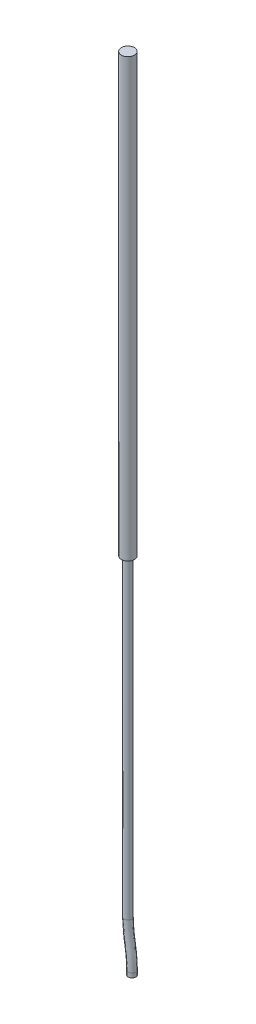
ISO-10303-21;
HEADER;
FILE_DESCRIPTION(('STEP AP214'),'2;1');
FILE_NAME('part.step','',(''),(''),'','','');
FILE_SCHEMA(('AUTOMOTIVE_DESIGN { 1 0 10303 214 1 1 1 1 }'));
ENDSEC;
DATA;
#1=APPLICATION_CONTEXT('core data for automotive mechanical design processes');
#2=APPLICATION_PROTOCOL_DEFINITION('international standard','automotive_design',2000,#1);
#3=PRODUCT_CONTEXT('',#1,'mechanical');
#4=PRODUCT('Part','Part','',(#3));
#5=PRODUCT_RELATED_PRODUCT_CATEGORY('part','',(#4));
#6=PRODUCT_DEFINITION_FORMATION('','',#4);
#7=PRODUCT_DEFINITION_CONTEXT('part definition',#1,'design');
#8=PRODUCT_DEFINITION('design','',#6,#7);
#9=PRODUCT_DEFINITION_SHAPE('','',#8);
#10=(LENGTH_UNIT() NAMED_UNIT(*) SI_UNIT(.MILLI.,.METRE.));
#11=(NAMED_UNIT(*) PLANE_ANGLE_UNIT() SI_UNIT($,.RADIAN.));
#12=(NAMED_UNIT(*) SI_UNIT($,.STERADIAN.) SOLID_ANGLE_UNIT());
#13=UNCERTAINTY_MEASURE_WITH_UNIT(LENGTH_MEASURE(1.E-05),#10,'distance_accuracy_value','');
#14=(GEOMETRIC_REPRESENTATION_CONTEXT(3) GLOBAL_UNCERTAINTY_ASSIGNED_CONTEXT((#13)) GLOBAL_UNIT_ASSIGNED_CONTEXT((#10,
#11,#12)) REPRESENTATION_CONTEXT('',''));
#15=CARTESIAN_POINT('',(0.,0.,0.));
#16=DIRECTION('',(0.,0.,1.));
#17=DIRECTION('',(1.,0.,0.));
#18=AXIS2_PLACEMENT_3D('',#15,#16,#17);
#19=CARTESIAN_POINT('',(0.,143.245,0.));
#20=DIRECTION('',(0.,-1.,0.));
#21=DIRECTION('',(0.,0.,-1.));
#22=AXIS2_PLACEMENT_3D('',#19,#20,#21);
#23=CYLINDRICAL_SURFACE('',#22,1.725);
#24=CARTESIAN_POINT('',(0.,143.245,0.));
#25=DIRECTION('',(0.,1.,0.));
#26=DIRECTION('',(0.,0.,1.));
#27=AXIS2_PLACEMENT_3D('',#24,#25,#26);
#28=CIRCLE('',#27,1.725);
#29=CARTESIAN_POINT('',(0.,143.245,1.725));
#30=VERTEX_POINT('',#29);
#31=EDGE_CURVE('E11',#30,#30,#28,.T.);
#32=ORIENTED_EDGE('',*,*,#31,.F.);
#33=EDGE_LOOP('',(#32));
#34=FACE_BOUND('',#33,.T.);
#35=CARTESIAN_POINT('',(0.,0.,0.));
#36=DIRECTION('',(0.,-1.,0.));
#37=DIRECTION('',(0.,0.,-1.));
#38=AXIS2_PLACEMENT_3D('',#35,#36,#37);
#39=CIRCLE('',#38,1.725);
#40=CARTESIAN_POINT('',(0.,0.,-1.725));
#41=VERTEX_POINT('',#40);
#42=EDGE_CURVE('E64',#41,#41,#39,.T.);
#43=ORIENTED_EDGE('',*,*,#42,.F.);
#44=EDGE_LOOP('',(#43));
#45=FACE_BOUND('',#44,.T.);
#46=ADVANCED_FACE('F46',(#34,#45),#23,.T.);
#47=CARTESIAN_POINT('',(0.,343.245,0.));
#48=DIRECTION('',(0.,-1.,0.));
#49=DIRECTION('',(0.,0.,-1.));
#50=AXIS2_PLACEMENT_3D('',#47,#48,#49);
#51=CYLINDRICAL_SURFACE('',#50,3.);
#52=CARTESIAN_POINT('',(0.,343.245,0.));
#53=DIRECTION('',(0.,1.,0.));
#54=DIRECTION('',(0.,0.,1.));
#55=AXIS2_PLACEMENT_3D('',#52,#53,#54);
#56=CIRCLE('',#55,3.);
#57=CARTESIAN_POINT('',(0.,343.245,3.));
#58=VERTEX_POINT('',#57);
#59=EDGE_CURVE('E55',#58,#58,#56,.T.);
#60=ORIENTED_EDGE('',*,*,#59,.F.);
#61=EDGE_LOOP('',(#60));
#62=FACE_BOUND('',#61,.T.);
#63=CARTESIAN_POINT('',(0.,143.245,0.));
#64=DIRECTION('',(0.,1.,0.));
#65=DIRECTION('',(0.,0.,1.));
#66=AXIS2_PLACEMENT_3D('',#63,#64,#65);
#67=CIRCLE('',#66,3.);
#68=CARTESIAN_POINT('',(0.,143.245,3.));
#69=VERTEX_POINT('',#68);
#70=EDGE_CURVE('E60',#69,#69,#67,.T.);
#71=ORIENTED_EDGE('',*,*,#70,.T.);
#72=EDGE_LOOP('',(#71));
#73=FACE_BOUND('',#72,.T.);
#74=ADVANCED_FACE('F78',(#62,#73),#51,.T.);
#75=CARTESIAN_POINT('',(0.,343.245,0.));
#76=DIRECTION('',(0.,1.,0.));
#77=DIRECTION('',(0.,0.,1.));
#78=AXIS2_PLACEMENT_3D('',#75,#76,#77);
#79=PLANE('',#78);
#80=ORIENTED_EDGE('',*,*,#59,.T.);
#81=EDGE_LOOP('',(#80));
#82=FACE_BOUND('',#81,.T.);
#83=ADVANCED_FACE('F82',(#82),#79,.T.);
#84=CARTESIAN_POINT('',(0.,143.245,0.));
#85=DIRECTION('',(0.,1.,0.));
#86=DIRECTION('',(0.,0.,1.));
#87=AXIS2_PLACEMENT_3D('',#84,#85,#86);
#88=PLANE('',#87);
#89=ORIENTED_EDGE('',*,*,#31,.T.);
#90=EDGE_LOOP('',(#89));
#91=FACE_BOUND('',#90,.T.);
#92=ORIENTED_EDGE('',*,*,#70,.F.);
#93=EDGE_LOOP('',(#92));
#94=FACE_BOUND('',#93,.T.);
#95=ADVANCED_FACE('F80',(#91,#94),#88,.F.);
#96=CARTESIAN_POINT('',(0.,0.,-1.725));
#97=CARTESIAN_POINT('',(0.131632502328734,-2.33887151220292,-1.725));
#98=CARTESIAN_POINT('',(0.263265009517513,-4.67774302389159,-1.725));
#99=CARTESIAN_POINT('',(0.83988268226508,-9.33788737578649,-1.725));
#100=CARTESIAN_POINT('',(1.28697097043585,-11.6589358080879,-1.725));
#101=CARTESIAN_POINT('',(1.74592927651871,-15.9903547135276,-1.725));
#102=CARTESIAN_POINT('',(1.81296464108095,-17.995177356473,-1.725));
#103=CARTESIAN_POINT('',(1.88,-20.,-1.725));
#104=CARTESIAN_POINT('',(3.45,0.,-1.725));
#105=CARTESIAN_POINT('',(3.58163250232873,-2.33887151220305,-1.725));
#106=CARTESIAN_POINT('',(3.71583528934996,-4.60068954340331,-1.725));
#107=CARTESIAN_POINT('',(4.2718140287462,-8.95273048209486,-1.725));
#108=CARTESIAN_POINT('',(4.72313304040415,-11.2935950559469,-1.725));
#109=CARTESIAN_POINT('',(5.19992437907432,-15.9861131761811,-1.725));
#110=CARTESIAN_POINT('',(5.26206823600098,-18.0738182587352,-1.725));
#111=CARTESIAN_POINT('',(5.32910359492035,-20.0786409022552,-1.725));
#112=CARTESIAN_POINT('',(3.45,0.,1.725));
#113=CARTESIAN_POINT('',(3.58163250232873,-2.33887151220305,1.725));
#114=CARTESIAN_POINT('',(3.71583528934996,-4.60068954340331,1.725));
#115=CARTESIAN_POINT('',(4.2718140287462,-8.95273048209486,1.725));
#116=CARTESIAN_POINT('',(4.72313304040415,-11.2935950559469,1.725));
#117=CARTESIAN_POINT('',(5.19992437907432,-15.9861131761811,1.725));
#118=CARTESIAN_POINT('',(5.26206823600098,-18.0738182587352,1.725));
#119=CARTESIAN_POINT('',(5.32910359492035,-20.0786409022552,1.725));
#120=CARTESIAN_POINT('',(0.,0.,1.725));
#121=CARTESIAN_POINT('',(0.131632502328734,-2.33887151220292,1.725));
#122=CARTESIAN_POINT('',(0.263265009517513,-4.67774302389159,1.725));
#123=CARTESIAN_POINT('',(0.839882682265081,-9.33788737578649,1.725));
#124=CARTESIAN_POINT('',(1.28697097043585,-11.6589358080879,1.725));
#125=CARTESIAN_POINT('',(1.74592927651871,-15.9903547135276,1.725));
#126=CARTESIAN_POINT('',(1.81296464108095,-17.995177356473,1.725));
#127=CARTESIAN_POINT('',(1.88,-20.,1.725));
#128=CARTESIAN_POINT('',(-3.45,0.,1.725));
#129=CARTESIAN_POINT('',(-3.31836749767127,-2.33887151220278,1.725));
#130=CARTESIAN_POINT('',(-3.18930527031493,-4.75479650437986,1.725));
#131=CARTESIAN_POINT('',(-2.59204866421604,-9.72304426947813,1.725));
#132=CARTESIAN_POINT('',(-2.14919109953245,-12.0242765602289,1.725));
#133=CARTESIAN_POINT('',(-1.70806582603689,-15.994596250874,1.725));
#134=CARTESIAN_POINT('',(-1.63613895383907,-17.9165364542109,1.725));
#135=CARTESIAN_POINT('',(-1.56910359492035,-19.9213590977448,1.725));
#136=CARTESIAN_POINT('',(-3.45,0.,-1.725));
#137=CARTESIAN_POINT('',(-3.31836749767127,-2.33887151220278,-1.725));
#138=CARTESIAN_POINT('',(-3.18930527031493,-4.75479650437986,-1.725));
#139=CARTESIAN_POINT('',(-2.59204866421604,-9.72304426947813,-1.725));
#140=CARTESIAN_POINT('',(-2.14919109953245,-12.0242765602289,-1.725));
#141=CARTESIAN_POINT('',(-1.70806582603689,-15.994596250874,-1.725));
#142=CARTESIAN_POINT('',(-1.63613895383907,-17.9165364542109,-1.725));
#143=CARTESIAN_POINT('',(-1.56910359492035,-19.9213590977448,-1.725));
#144=CARTESIAN_POINT('',(0.,0.,-1.725));
#145=CARTESIAN_POINT('',(0.131632502328734,-2.33887151220292,-1.725));
#146=CARTESIAN_POINT('',(0.263265009517513,-4.67774302389159,-1.725));
#147=CARTESIAN_POINT('',(0.83988268226508,-9.33788737578649,-1.725));
#148=CARTESIAN_POINT('',(1.28697097043585,-11.6589358080879,-1.725));
#149=CARTESIAN_POINT('',(1.74592927651871,-15.9903547135276,-1.725));
#150=CARTESIAN_POINT('',(1.81296464108095,-17.995177356473,-1.725));
#151=CARTESIAN_POINT('',(1.88,-20.,-1.725));
#152=(BOUNDED_SURFACE() B_SPLINE_SURFACE(3,3,((#96,#97,#98,#99,#100,#101,#102,#103),(#104,#105,
#106,#107,#108,#109,#110,#111),(#112,#113,#114,#115,#116,#117,#118,#119),(#120,#121,#122,#123,
#124,#125,#126,#127),(#128,#129,#130,#131,#132,#133,#134,#135),(#136,#137,#138,#139,#140,#141,
#142,#143),(#144,#145,#146,#147,#148,#149,#150,#151)),.UNSPECIFIED.,.T.,.F.,
.F.) B_SPLINE_SURFACE_WITH_KNOTS((4,3,4),(4,2,2,4),(0.,0.5,1.),(0.,0.349327238871358,
0.7010056922802,1.),
.UNSPECIFIED.) GEOMETRIC_REPRESENTATION_ITEM() RATIONAL_B_SPLINE_SURFACE(((1.,1.,1.,1.,1.,1.,1.,
1.),(0.333333333333333,0.333333333333333,0.333333333333333,0.333333333333333,0.333333333333333,
0.333333333333333,0.333333333333333,0.333333333333333),(0.333333333333333,0.333333333333333,
0.333333333333333,0.333333333333333,0.333333333333333,0.333333333333333,0.333333333333333,
0.333333333333333),(1.,1.,1.,1.,1.,1.,1.,1.),(0.333333333333333,0.333333333333333,
0.333333333333333,0.333333333333333,0.333333333333333,0.333333333333333,0.333333333333333,
0.333333333333333),(0.333333333333333,0.333333333333333,0.333333333333333,0.333333333333333,
0.333333333333333,0.333333333333333,0.333333333333333,0.333333333333333),(1.,1.,1.,1.,1.,1.,1.,1.))) REPRESENTATION_ITEM('') SURFACE());
#153=CARTESIAN_POINT('',(2.1978253225301,-20.0072465408578,-1.69545260977835));
#154=CARTESIAN_POINT('',(2.33907632956884,-20.0104671187071,-1.66896028279752));
#155=CARTESIAN_POINT('',(2.49563883879609,-20.0140368047563,-1.62181157607104));
#156=CARTESIAN_POINT('',(2.82379254776201,-20.0215188368384,-1.45542899739218));
#157=CARTESIAN_POINT('',(2.9958922454958,-20.0254427768231,-1.33516372087841));
#158=CARTESIAN_POINT('',(3.30664277191014,-20.0325280095802,-0.99607094624293));
#159=CARTESIAN_POINT('',(3.44403142042184,-20.0356605241543,-0.775485032756843));
#160=CARTESIAN_POINT('',(3.606296091015,-20.0393602216985,-0.259221087440385));
#161=CARTESIAN_POINT('',(3.62798297155317,-20.0398546910021,0.0353324888069678));
#162=CARTESIAN_POINT('',(3.52204119737646,-20.0374391773828,0.600483358733086));
#163=CARTESIAN_POINT('',(3.39514570372856,-20.0345459108172,0.867169573727242));
#164=CARTESIAN_POINT('',(3.05692237706337,-20.0268342875386,1.28956451271714));
#165=CARTESIAN_POINT('',(2.84897430746679,-20.0220929907451,1.4453808118379));
#166=CARTESIAN_POINT('',(2.43651967784282,-20.0126888649134,1.6488328723315));
#167=CARTESIAN_POINT('',(2.23255269443668,-20.008038338432,1.6985649774915));
#168=CARTESIAN_POINT('',(1.86642945360582,-19.9996905862688,1.73473247059416));
#169=CARTESIAN_POINT('',(1.70342568450863,-19.9959740369916,1.72194493675919));
#170=CARTESIAN_POINT('',(1.42092367043116,-19.9895328812928,1.66896028279752));
#171=CARTESIAN_POINT('',(1.26436116120392,-19.9859631952437,1.62181157607104));
#172=CARTESIAN_POINT('',(0.936207452237986,-19.9784811631616,1.45542899739218));
#173=CARTESIAN_POINT('',(0.764107754504199,-19.9745572231769,1.33516372087841));
#174=CARTESIAN_POINT('',(0.453357228089855,-19.9674719904197,0.996070946242931));
#175=CARTESIAN_POINT('',(0.315968579578165,-19.9643394758457,0.775485032756843));
#176=CARTESIAN_POINT('',(0.153703908985003,-19.9606397783015,0.259221087440386));
#177=CARTESIAN_POINT('',(0.132017028446834,-19.9601453089979,-0.035332488806967));
#178=CARTESIAN_POINT('',(0.237958802623536,-19.9625608226172,-0.600483358733085));
#179=CARTESIAN_POINT('',(0.36485429627144,-19.9654540891828,-0.867169573727241));
#180=CARTESIAN_POINT('',(0.703077622936632,-19.9731657124614,-1.28956451271714));
#181=CARTESIAN_POINT('',(0.911025692533206,-19.977907009255,-1.4453808118379));
#182=CARTESIAN_POINT('',(1.32348032215718,-19.9873111350866,-1.6488328723315));
#183=CARTESIAN_POINT('',(1.52744730556332,-19.991961661568,-1.6985649774915));
#184=CARTESIAN_POINT('',(1.89357054639418,-20.0003094137312,-1.73473247059416));
#185=CARTESIAN_POINT('',(2.05657431549137,-20.0040259630084,-1.72194493675919));
#186=CARTESIAN_POINT('',(2.1978253225301,-20.0072465408578,-1.69545260977835));
#187=B_SPLINE_CURVE_WITH_KNOTS('',3,(#153,#154,#155,#156,#157,#158,#159,#160,#161,#162,#163,
#164,#165,#166,#167,#168,#169,#170,#171,#172,#173,#174,#175,#176,#177,#178,#179,#180,#181,#182,
#183,#184,#185,#186),.UNSPECIFIED.,.T.,.F.,(4,2,2,2,2,2,2,2,2,2,2,2,2,2,2,2,4),(0.,0.0625,0.125,
0.1875,0.25,0.3125,0.375,0.4375,0.5,0.5625,0.625,0.6875,0.75,0.8125,0.875,0.9375,1.),.UNSPECIFIED.);
#188=CARTESIAN_POINT('',(1.8799999175794,-19.9999999981208,-1.72508795933688));
#189=VERTEX_POINT('',#188);
#190=EDGE_CURVE('E66',#189,#189,#187,.T.);
#191=ORIENTED_EDGE('',*,*,#190,.F.);
#192=EDGE_LOOP('',(#191));
#193=FACE_BOUND('',#192,.T.);
#194=ORIENTED_EDGE('',*,*,#42,.T.);
#195=EDGE_LOOP('',(#194));
#196=FACE_BOUND('',#195,.T.);
#197=ADVANCED_FACE('F71',(#193,#196),#152,.T.);
#198=CARTESIAN_POINT('',(1.88,-22.,0.));
#199=DIRECTION('',(0.,-1.,0.));
#200=DIRECTION('',(0.,0.,-1.));
#201=AXIS2_PLACEMENT_3D('',#198,#199,#200);
#202=PLANE('',#201);
#203=CARTESIAN_POINT('',(1.88,-22.,0.));
#204=DIRECTION('',(0.,-1.,0.));
#205=DIRECTION('',(0.,0.,-1.));
#206=AXIS2_PLACEMENT_3D('',#203,#204,#205);
#207=CIRCLE('',#206,1.725);
#208=CARTESIAN_POINT('',(1.88,-22.,-1.725));
#209=VERTEX_POINT('',#208);
#210=EDGE_CURVE('E67',#209,#209,#207,.T.);
#211=ORIENTED_EDGE('',*,*,#210,.T.);
#212=EDGE_LOOP('',(#211));
#213=FACE_BOUND('',#212,.T.);
#214=ADVANCED_FACE('F88',(#213),#202,.T.);
#215=CARTESIAN_POINT('',(2.1978253225301,-20.0072465408578,-1.69545260977835));
#216=CARTESIAN_POINT('',(2.19175298814914,-22.,-1.69659514156445));
#217=CARTESIAN_POINT('',(2.33907632956884,-20.0104671187071,-1.66896028279752));
#218=CARTESIAN_POINT('',(2.33313591661285,-22.,-1.67061572588535));
#219=CARTESIAN_POINT('',(2.49563883879609,-20.0140368047563,-1.62181157607104));
#220=CARTESIAN_POINT('',(2.48990918834441,-22.,-1.62403564676797));
#221=CARTESIAN_POINT('',(2.82379254776201,-20.0215188368384,-1.45542899739218));
#222=CARTESIAN_POINT('',(2.81874982817803,-22.,-1.45884535167224));
#223=CARTESIAN_POINT('',(2.9958922454958,-20.0254427768231,-1.33516372087841));
#224=CARTESIAN_POINT('',(2.99132956607637,-22.,-1.33920558375647));
#225=CARTESIAN_POINT('',(3.30664277191014,-20.0325280095802,-0.99607094624293));
#226=CARTESIAN_POINT('',(3.30338938483959,-22.,-1.00124305696767));
#227=CARTESIAN_POINT('',(3.44403142042184,-20.0356605241543,-0.775485032756843));
#228=CARTESIAN_POINT('',(3.44161334715043,-22.,-0.781157312633771));
#229=CARTESIAN_POINT('',(3.606296091015,-20.0393602216985,-0.259221087440385));
#230=CARTESIAN_POINT('',(3.60579265622131,-22.,-0.265485782693105));
#231=CARTESIAN_POINT('',(3.62798297155317,-20.0398546910021,0.0353324888069678));
#232=CARTESIAN_POINT('',(3.62855397292264,-22.,0.0289871312217339));
#233=CARTESIAN_POINT('',(3.52204119737646,-20.0374391773828,0.600483358733086));
#234=CARTESIAN_POINT('',(3.52463631020626,-22.,0.594518845076549));
#235=CARTESIAN_POINT('',(3.39514570372856,-20.0345459108172,0.867169573727242));
#236=CARTESIAN_POINT('',(3.39867648416375,-22.,0.861663930733794));
#237=CARTESIAN_POINT('',(3.05692237706337,-20.0268342875386,1.28956451271714));
#238=CARTESIAN_POINT('',(3.0619003650449,-22.,1.28528382864888));
#239=CARTESIAN_POINT('',(2.84897430746679,-20.0220929907451,1.4453808118379));
#240=CARTESIAN_POINT('',(2.85446508190483,-22.,1.44185394688513));
#241=CARTESIAN_POINT('',(2.43651967784282,-20.0126888649134,1.6488328723315));
#242=CARTESIAN_POINT('',(2.44264430693388,-22.,1.64680186539696));
#243=CARTESIAN_POINT('',(2.23255269443668,-20.008038338432,1.6985649774915));
#244=CARTESIAN_POINT('',(2.23880613609046,-22.,1.69727403700871));
#245=CARTESIAN_POINT('',(1.86642945360582,-19.9996905862688,1.73473247059416));
#246=CARTESIAN_POINT('',(1.87272140593928,-22.,1.73477030815855));
#247=CARTESIAN_POINT('',(1.70342568450863,-19.9959740369916,1.72194493675919));
#248=CARTESIAN_POINT('',(1.70962994031456,-22.,1.72257455724354));
#249=CARTESIAN_POINT('',(1.42092367043116,-19.9895328812928,1.66896028279752));
#250=CARTESIAN_POINT('',(1.42686408338716,-22.,1.67061572588535));
#251=CARTESIAN_POINT('',(1.26436116120392,-19.9859631952437,1.62181157607104));
#252=CARTESIAN_POINT('',(1.27009081165559,-22.,1.62403564676797));
#253=CARTESIAN_POINT('',(0.936207452237986,-19.9784811631616,1.45542899739218));
#254=CARTESIAN_POINT('',(0.941250171821968,-22.,1.45884535167225));
#255=CARTESIAN_POINT('',(0.764107754504199,-19.9745572231769,1.33516372087841));
#256=CARTESIAN_POINT('',(0.768670433923629,-22.,1.33920558375647));
#257=CARTESIAN_POINT('',(0.453357228089855,-19.9674719904197,0.996070946242931));
#258=CARTESIAN_POINT('',(0.45661061516041,-22.,1.00124305696768));
#259=CARTESIAN_POINT('',(0.315968579578165,-19.9643394758457,0.775485032756843));
#260=CARTESIAN_POINT('',(0.31838665284957,-22.,0.781157312633772));
#261=CARTESIAN_POINT('',(0.153703908985003,-19.9606397783015,0.259221087440386));
#262=CARTESIAN_POINT('',(0.154207343778687,-22.,0.265485782693106));
#263=CARTESIAN_POINT('',(0.132017028446834,-19.9601453089979,-0.035332488806967));
#264=CARTESIAN_POINT('',(0.131446027077364,-22.,-0.0289871312217333));
#265=CARTESIAN_POINT('',(0.237958802623536,-19.9625608226172,-0.600483358733085));
#266=CARTESIAN_POINT('',(0.235363689793744,-22.,-0.594518845076549));
#267=CARTESIAN_POINT('',(0.36485429627144,-19.9654540891828,-0.867169573727241));
#268=CARTESIAN_POINT('',(0.361323515836248,-22.,-0.861663930733793));
#269=CARTESIAN_POINT('',(0.703077622936632,-19.9731657124614,-1.28956451271714));
#270=CARTESIAN_POINT('',(0.698099634955098,-22.,-1.28528382864888));
#271=CARTESIAN_POINT('',(0.911025692533206,-19.977907009255,-1.4453808118379));
#272=CARTESIAN_POINT('',(0.905534918095174,-22.,-1.44185394688513));
#273=CARTESIAN_POINT('',(1.32348032215718,-19.9873111350866,-1.6488328723315));
#274=CARTESIAN_POINT('',(1.31735569306612,-22.,-1.64680186539696));
#275=CARTESIAN_POINT('',(1.52744730556332,-19.991961661568,-1.6985649774915));
#276=CARTESIAN_POINT('',(1.52119386390954,-22.,-1.69727403700871));
#277=CARTESIAN_POINT('',(1.89357054639418,-20.0003094137312,-1.73473247059416));
#278=CARTESIAN_POINT('',(1.88727859406072,-22.,-1.73477030815855));
#279=CARTESIAN_POINT('',(2.05657431549137,-20.0040259630084,-1.72194493675919));
#280=CARTESIAN_POINT('',(2.05037005968544,-22.,-1.72257455724354));
#281=CARTESIAN_POINT('',(2.1978253225301,-20.0072465408578,-1.69545260977835));
#282=CARTESIAN_POINT('',(2.19175298814914,-22.,-1.69659514156445));
#283=B_SPLINE_SURFACE_WITH_KNOTS('',3,1,((#215,#216),(#217,#218),(#219,#220),(#221,#222),(#223,
#224),(#225,#226),(#227,#228),(#229,#230),(#231,#232),(#233,#234),(#235,#236),(#237,#238),(#239,
#240),(#241,#242),(#243,#244),(#245,#246),(#247,#248),(#249,#250),(#251,#252),(#253,#254),(#255,
#256),(#257,#258),(#259,#260),(#261,#262),(#263,#264),(#265,#266),(#267,#268),(#269,#270),(#271,
#272),(#273,#274),(#275,#276),(#277,#278),(#279,#280),(#281,#282)),.UNSPECIFIED.,.T.,.F.,.F.,(4,
2,2,2,2,2,2,2,2,2,2,2,2,2,2,2,4),(2,2),(0.,0.0625,0.125,0.1875,0.25,0.3125,0.375,0.4375,0.5,
0.5625,0.625,0.6875,0.75,0.8125,0.875,0.9375,1.),(0.,1.),.UNSPECIFIED.);
#284=ORIENTED_EDGE('',*,*,#190,.T.);
#285=EDGE_LOOP('',(#284));
#286=FACE_BOUND('',#285,.T.);
#287=ORIENTED_EDGE('',*,*,#210,.F.);
#288=EDGE_LOOP('',(#287));
#289=FACE_BOUND('',#288,.T.);
#290=ADVANCED_FACE('F129',(#286,#289),#283,.T.);
#291=CLOSED_SHELL('',(#46,#74,#83,#95,#197,#214,#290));
#292=MANIFOLD_SOLID_BREP('B2',#291);
#293=ADVANCED_BREP_SHAPE_REPRESENTATION('',(#18,#292),#14);
#294=SHAPE_DEFINITION_REPRESENTATION(#9,#293);
ENDSEC;
END-ISO-10303-21;
